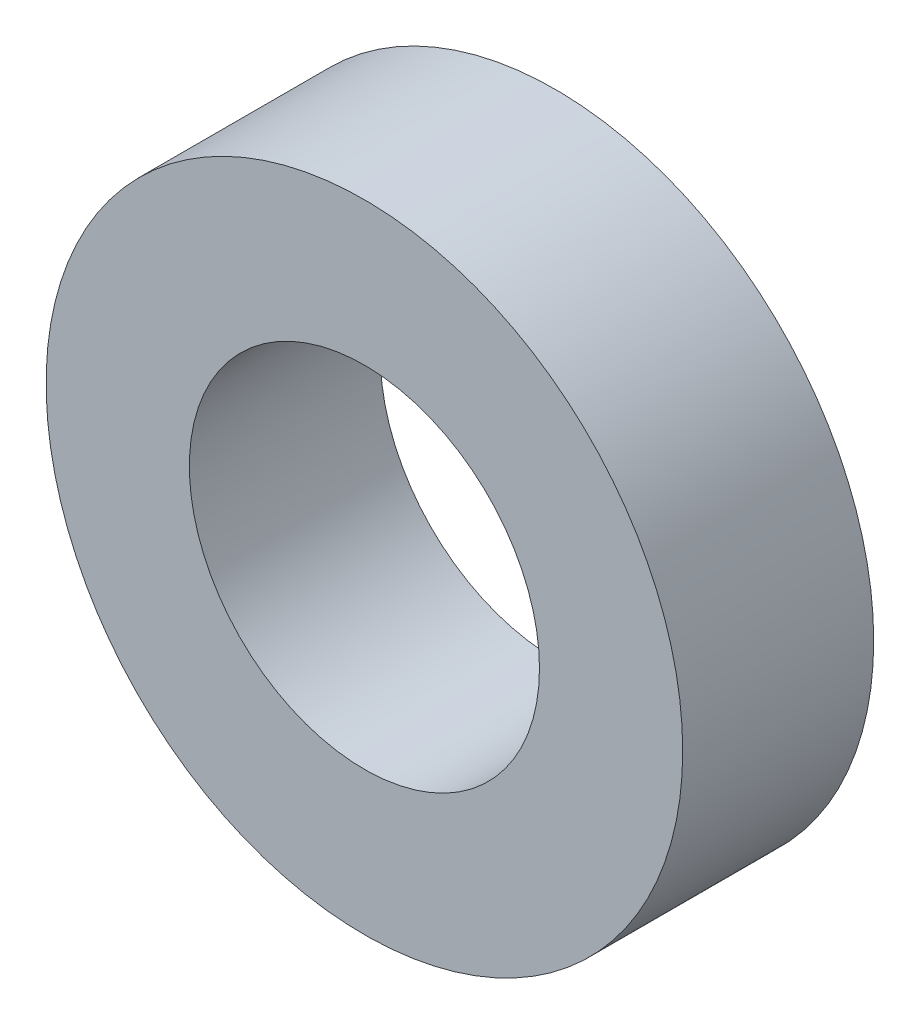
ISO-10303-21;
HEADER;
FILE_DESCRIPTION(('STEP AP214'),'2;1');
FILE_NAME('part.step','',(''),(''),'','','');
FILE_SCHEMA(('AUTOMOTIVE_DESIGN { 1 0 10303 214 1 1 1 1 }'));
ENDSEC;
DATA;
#1=APPLICATION_CONTEXT('core data for automotive mechanical design processes');
#2=APPLICATION_PROTOCOL_DEFINITION('international standard','automotive_design',2000,#1);
#3=PRODUCT_CONTEXT('',#1,'mechanical');
#4=PRODUCT('Part','Part','',(#3));
#5=PRODUCT_RELATED_PRODUCT_CATEGORY('part','',(#4));
#6=PRODUCT_DEFINITION_FORMATION('','',#4);
#7=PRODUCT_DEFINITION_CONTEXT('part definition',#1,'design');
#8=PRODUCT_DEFINITION('design','',#6,#7);
#9=PRODUCT_DEFINITION_SHAPE('','',#8);
#10=(LENGTH_UNIT() NAMED_UNIT(*) SI_UNIT(.MILLI.,.METRE.));
#11=(NAMED_UNIT(*) PLANE_ANGLE_UNIT() SI_UNIT($,.RADIAN.));
#12=(NAMED_UNIT(*) SI_UNIT($,.STERADIAN.) SOLID_ANGLE_UNIT());
#13=UNCERTAINTY_MEASURE_WITH_UNIT(LENGTH_MEASURE(1.E-05),#10,'distance_accuracy_value','');
#14=(GEOMETRIC_REPRESENTATION_CONTEXT(3) GLOBAL_UNCERTAINTY_ASSIGNED_CONTEXT((#13)) GLOBAL_UNIT_ASSIGNED_CONTEXT((#10,
#11,#12)) REPRESENTATION_CONTEXT('',''));
#15=CARTESIAN_POINT('',(0.,0.,0.));
#16=DIRECTION('',(0.,0.,1.));
#17=DIRECTION('',(1.,0.,0.));
#18=AXIS2_PLACEMENT_3D('',#15,#16,#17);
#19=CARTESIAN_POINT('',(0.,0.,3.));
#20=DIRECTION('',(0.,0.,1.));
#21=DIRECTION('',(1.,0.,0.));
#22=AXIS2_PLACEMENT_3D('',#19,#20,#21);
#23=PLANE('',#22);
#24=CARTESIAN_POINT('',(0.,0.,3.));
#25=DIRECTION('',(0.,0.,1.));
#26=DIRECTION('',(1.,0.,0.));
#27=AXIS2_PLACEMENT_3D('',#24,#25,#26);
#28=CIRCLE('',#27,5.);
#29=CARTESIAN_POINT('',(5.,0.,3.));
#30=VERTEX_POINT('',#29);
#31=EDGE_CURVE('E10',#30,#30,#28,.T.);
#32=ORIENTED_EDGE('',*,*,#31,.T.);
#33=EDGE_LOOP('',(#32));
#34=FACE_BOUND('',#33,.T.);
#35=CARTESIAN_POINT('',(0.,0.,3.));
#36=DIRECTION('',(0.,0.,1.));
#37=DIRECTION('',(1.,0.,0.));
#38=AXIS2_PLACEMENT_3D('',#35,#36,#37);
#39=CIRCLE('',#38,2.75);
#40=CARTESIAN_POINT('',(2.75,0.,3.));
#41=VERTEX_POINT('',#40);
#42=EDGE_CURVE('E43',#41,#41,#39,.T.);
#43=ORIENTED_EDGE('',*,*,#42,.F.);
#44=EDGE_LOOP('',(#43));
#45=FACE_BOUND('',#44,.T.);
#46=ADVANCED_FACE('F32',(#34,#45),#23,.T.);
#47=CARTESIAN_POINT('',(0.,0.,0.));
#48=DIRECTION('',(0.,0.,1.));
#49=DIRECTION('',(1.,0.,0.));
#50=AXIS2_PLACEMENT_3D('',#47,#48,#49);
#51=PLANE('',#50);
#52=CARTESIAN_POINT('',(0.,0.,0.));
#53=DIRECTION('',(0.,0.,1.));
#54=DIRECTION('',(1.,0.,0.));
#55=AXIS2_PLACEMENT_3D('',#52,#53,#54);
#56=CIRCLE('',#55,5.);
#57=CARTESIAN_POINT('',(5.,0.,0.));
#58=VERTEX_POINT('',#57);
#59=EDGE_CURVE('E36',#58,#58,#56,.T.);
#60=ORIENTED_EDGE('',*,*,#59,.F.);
#61=EDGE_LOOP('',(#60));
#62=FACE_BOUND('',#61,.T.);
#63=CARTESIAN_POINT('',(0.,0.,0.));
#64=DIRECTION('',(0.,0.,1.));
#65=DIRECTION('',(1.,0.,0.));
#66=AXIS2_PLACEMENT_3D('',#63,#64,#65);
#67=CIRCLE('',#66,2.75);
#68=CARTESIAN_POINT('',(2.75,0.,0.));
#69=VERTEX_POINT('',#68);
#70=EDGE_CURVE('E45',#69,#69,#67,.T.);
#71=ORIENTED_EDGE('',*,*,#70,.T.);
#72=EDGE_LOOP('',(#71));
#73=FACE_BOUND('',#72,.T.);
#74=ADVANCED_FACE('F55',(#62,#73),#51,.F.);
#75=CARTESIAN_POINT('',(0.,0.,3.));
#76=DIRECTION('',(0.,0.,-1.));
#77=DIRECTION('',(-1.,0.,0.));
#78=AXIS2_PLACEMENT_3D('',#75,#76,#77);
#79=CYLINDRICAL_SURFACE('',#78,5.);
#80=ORIENTED_EDGE('',*,*,#31,.F.);
#81=EDGE_LOOP('',(#80));
#82=FACE_BOUND('',#81,.T.);
#83=ORIENTED_EDGE('',*,*,#59,.T.);
#84=EDGE_LOOP('',(#83));
#85=FACE_BOUND('',#84,.T.);
#86=ADVANCED_FACE('F34',(#82,#85),#79,.T.);
#87=CARTESIAN_POINT('',(0.,0.,3.));
#88=DIRECTION('',(0.,0.,-1.));
#89=DIRECTION('',(-1.,0.,0.));
#90=AXIS2_PLACEMENT_3D('',#87,#88,#89);
#91=CYLINDRICAL_SURFACE('',#90,2.75);
#92=ORIENTED_EDGE('',*,*,#42,.T.);
#93=EDGE_LOOP('',(#92));
#94=FACE_BOUND('',#93,.T.);
#95=ORIENTED_EDGE('',*,*,#70,.F.);
#96=EDGE_LOOP('',(#95));
#97=FACE_BOUND('',#96,.T.);
#98=ADVANCED_FACE('F51',(#94,#97),#91,.F.);
#99=CLOSED_SHELL('',(#46,#74,#86,#98));
#100=MANIFOLD_SOLID_BREP('B2',#99);
#101=ADVANCED_BREP_SHAPE_REPRESENTATION('',(#18,#100),#14);
#102=SHAPE_DEFINITION_REPRESENTATION(#9,#101);
ENDSEC;
END-ISO-10303-21;
